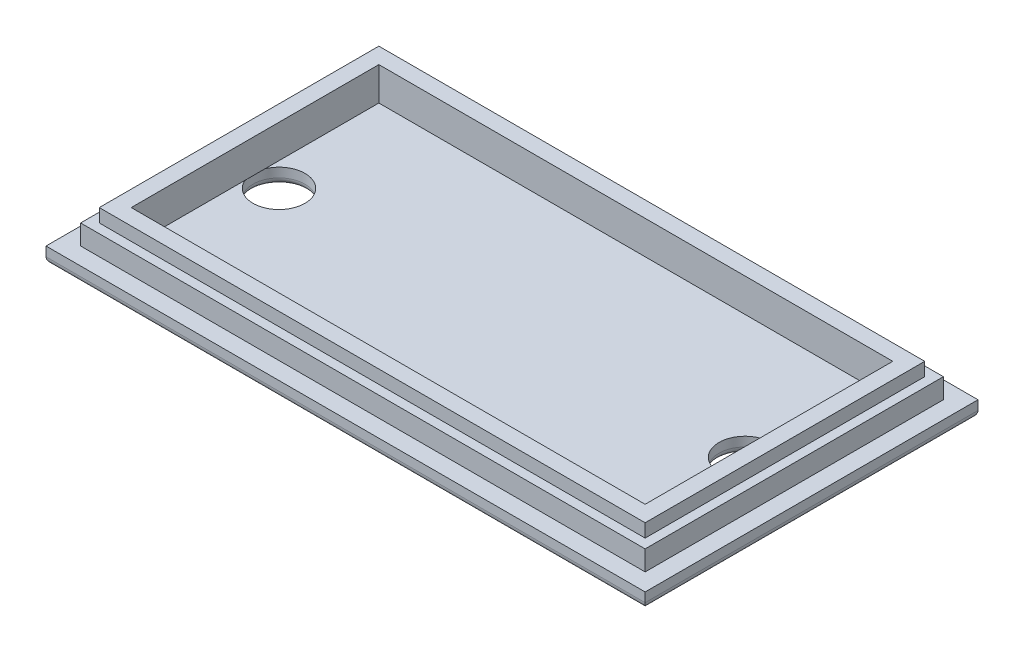
ISO-10303-21;
HEADER;
FILE_DESCRIPTION(('STEP AP214'),'2;1');
FILE_NAME('part.step','',(''),(''),'','','');
FILE_SCHEMA(('AUTOMOTIVE_DESIGN { 1 0 10303 214 1 1 1 1 }'));
ENDSEC;
DATA;
#1=APPLICATION_CONTEXT('core data for automotive mechanical design processes');
#2=APPLICATION_PROTOCOL_DEFINITION('international standard','automotive_design',2000,#1);
#3=PRODUCT_CONTEXT('',#1,'mechanical');
#4=PRODUCT('Part','Part','',(#3));
#5=PRODUCT_RELATED_PRODUCT_CATEGORY('part','',(#4));
#6=PRODUCT_DEFINITION_FORMATION('','',#4);
#7=PRODUCT_DEFINITION_CONTEXT('part definition',#1,'design');
#8=PRODUCT_DEFINITION('design','',#6,#7);
#9=PRODUCT_DEFINITION_SHAPE('','',#8);
#10=(LENGTH_UNIT() NAMED_UNIT(*) SI_UNIT(.MILLI.,.METRE.));
#11=(NAMED_UNIT(*) PLANE_ANGLE_UNIT() SI_UNIT($,.RADIAN.));
#12=(NAMED_UNIT(*) SI_UNIT($,.STERADIAN.) SOLID_ANGLE_UNIT());
#13=UNCERTAINTY_MEASURE_WITH_UNIT(LENGTH_MEASURE(1.E-05),#10,'distance_accuracy_value','');
#14=(GEOMETRIC_REPRESENTATION_CONTEXT(3) GLOBAL_UNCERTAINTY_ASSIGNED_CONTEXT((#13)) GLOBAL_UNIT_ASSIGNED_CONTEXT((#10,
#11,#12)) REPRESENTATION_CONTEXT('',''));
#15=CARTESIAN_POINT('',(0.,0.,0.));
#16=DIRECTION('',(0.,0.,1.));
#17=DIRECTION('',(1.,0.,0.));
#18=AXIS2_PLACEMENT_3D('',#15,#16,#17);
#19=CARTESIAN_POINT('',(0.,1.2,-25.));
#20=DIRECTION('',(0.,1.,0.));
#21=DIRECTION('',(0.,0.,1.));
#22=AXIS2_PLACEMENT_3D('',#19,#20,#21);
#23=PLANE('',#22);
#24=CARTESIAN_POINT('',(40.,1.2,-12.5));
#25=DIRECTION('',(0.,1.,0.));
#26=DIRECTION('',(0.,0.,1.));
#27=AXIS2_PLACEMENT_3D('',#24,#25,#26);
#28=CIRCLE('',#27,1.95);
#29=CARTESIAN_POINT('',(41.8,1.2,-13.25));
#30=VERTEX_POINT('',#29);
#31=CARTESIAN_POINT('',(41.8,1.2,-11.75));
#32=VERTEX_POINT('',#31);
#33=EDGE_CURVE('E297',#30,#32,#28,.T.);
#34=ORIENTED_EDGE('',*,*,#33,.F.);
#35=DIRECTION('',(0.,0.,1.));
#36=VECTOR('',#35,1.);
#37=CARTESIAN_POINT('',(41.8,1.2,-23.));
#38=LINE('',#37,#36);
#39=CARTESIAN_POINT('',(41.8,1.2,-21.8));
#40=VERTEX_POINT('',#39);
#41=EDGE_CURVE('E258',#40,#30,#38,.T.);
#42=ORIENTED_EDGE('',*,*,#41,.F.);
#43=DIRECTION('',(1.,0.,0.));
#44=VECTOR('',#43,1.);
#45=CARTESIAN_POINT('',(2.,1.2,-21.8));
#46=LINE('',#45,#44);
#47=CARTESIAN_POINT('',(3.2,1.2,-21.8));
#48=VERTEX_POINT('',#47);
#49=EDGE_CURVE('E250',#48,#40,#46,.T.);
#50=ORIENTED_EDGE('',*,*,#49,.F.);
#51=DIRECTION('',(0.,0.,1.));
#52=VECTOR('',#51,1.);
#53=CARTESIAN_POINT('',(3.2,1.2,-23.));
#54=LINE('',#53,#52);
#55=CARTESIAN_POINT('',(3.2,1.2,-13.25));
#56=VERTEX_POINT('',#55);
#57=EDGE_CURVE('E253',#48,#56,#54,.T.);
#58=ORIENTED_EDGE('',*,*,#57,.T.);
#59=CARTESIAN_POINT('',(5.,1.2,-12.5));
#60=DIRECTION('',(0.,1.,0.));
#61=DIRECTION('',(0.,0.,1.));
#62=AXIS2_PLACEMENT_3D('',#59,#60,#61);
#63=CIRCLE('',#62,1.95);
#64=CARTESIAN_POINT('',(3.2,1.2,-11.75));
#65=VERTEX_POINT('',#64);
#66=EDGE_CURVE('E286',#65,#56,#63,.T.);
#67=ORIENTED_EDGE('',*,*,#66,.F.);
#68=CARTESIAN_POINT('',(3.2,1.2,-3.2));
#69=VERTEX_POINT('',#68);
#70=EDGE_CURVE('E263',#65,#69,#54,.T.);
#71=ORIENTED_EDGE('',*,*,#70,.T.);
#72=DIRECTION('',(1.,0.,0.));
#73=VECTOR('',#72,1.);
#74=CARTESIAN_POINT('',(2.,1.2,-3.2));
#75=LINE('',#74,#73);
#76=CARTESIAN_POINT('',(41.8,1.2,-3.2));
#77=VERTEX_POINT('',#76);
#78=EDGE_CURVE('E260',#69,#77,#75,.T.);
#79=ORIENTED_EDGE('',*,*,#78,.T.);
#80=EDGE_CURVE('E244',#32,#77,#38,.T.);
#81=ORIENTED_EDGE('',*,*,#80,.F.);
#82=EDGE_LOOP('',(#34,#42,#50,#58,#67,#71,#79,#81));
#83=FACE_BOUND('',#82,.T.);
#84=ADVANCED_FACE('F81',(#83),#23,.T.);
#85=DIRECTION('',(-1.,0.,0.));
#86=VECTOR('',#85,1.);
#87=CARTESIAN_POINT('',(0.,1.2,0.));
#88=LINE('',#87,#86);
#89=CARTESIAN_POINT('',(45.,1.2,0.));
#90=VERTEX_POINT('',#89);
#91=CARTESIAN_POINT('',(0.,1.2,0.));
#92=VERTEX_POINT('',#91);
#93=EDGE_CURVE('E336',#90,#92,#88,.T.);
#94=ORIENTED_EDGE('',*,*,#93,.F.);
#95=DIRECTION('',(0.,0.,1.));
#96=VECTOR('',#95,1.);
#97=CARTESIAN_POINT('',(45.,1.2,-25.));
#98=LINE('',#97,#96);
#99=CARTESIAN_POINT('',(45.,1.2,-25.));
#100=VERTEX_POINT('',#99);
#101=EDGE_CURVE('E341',#100,#90,#98,.T.);
#102=ORIENTED_EDGE('',*,*,#101,.F.);
#103=DIRECTION('',(-1.,0.,0.));
#104=VECTOR('',#103,1.);
#105=CARTESIAN_POINT('',(0.,1.2,-25.));
#106=LINE('',#105,#104);
#107=CARTESIAN_POINT('',(0.,1.2,-25.));
#108=VERTEX_POINT('',#107);
#109=EDGE_CURVE('E338',#100,#108,#106,.T.);
#110=ORIENTED_EDGE('',*,*,#109,.T.);
#111=DIRECTION('',(0.,0.,1.));
#112=VECTOR('',#111,1.);
#113=CARTESIAN_POINT('',(0.,1.2,-25.));
#114=LINE('',#113,#112);
#115=EDGE_CURVE('E347',#108,#92,#114,.T.);
#116=ORIENTED_EDGE('',*,*,#115,.T.);
#117=EDGE_LOOP('',(#94,#102,#110,#116));
#118=FACE_BOUND('',#117,.T.);
#119=DIRECTION('',(1.,0.,0.));
#120=VECTOR('',#119,1.);
#121=CARTESIAN_POINT('',(1.3,1.2,-1.3));
#122=LINE('',#121,#120);
#123=CARTESIAN_POINT('',(1.3,1.2,-1.3));
#124=VERTEX_POINT('',#123);
#125=CARTESIAN_POINT('',(43.7,1.2,-1.3));
#126=VERTEX_POINT('',#125);
#127=EDGE_CURVE('E314',#124,#126,#122,.T.);
#128=ORIENTED_EDGE('',*,*,#127,.F.);
#129=DIRECTION('',(0.,0.,1.));
#130=VECTOR('',#129,1.);
#131=CARTESIAN_POINT('',(1.3,1.2,-23.7));
#132=LINE('',#131,#130);
#133=CARTESIAN_POINT('',(1.3,1.2,-23.7));
#134=VERTEX_POINT('',#133);
#135=EDGE_CURVE('E311',#134,#124,#132,.T.);
#136=ORIENTED_EDGE('',*,*,#135,.F.);
#137=DIRECTION('',(1.,0.,0.));
#138=VECTOR('',#137,1.);
#139=CARTESIAN_POINT('',(1.3,1.2,-23.7));
#140=LINE('',#139,#138);
#141=CARTESIAN_POINT('',(43.7,1.2,-23.7));
#142=VERTEX_POINT('',#141);
#143=EDGE_CURVE('E302',#134,#142,#140,.T.);
#144=ORIENTED_EDGE('',*,*,#143,.T.);
#145=DIRECTION('',(0.,0.,1.));
#146=VECTOR('',#145,1.);
#147=CARTESIAN_POINT('',(43.7,1.2,-23.7));
#148=LINE('',#147,#146);
#149=EDGE_CURVE('E318',#142,#126,#148,.T.);
#150=ORIENTED_EDGE('',*,*,#149,.T.);
#151=EDGE_LOOP('',(#128,#136,#144,#150));
#152=FACE_BOUND('',#151,.T.);
#153=ADVANCED_FACE('F424',(#118,#152),#23,.T.);
#154=CARTESIAN_POINT('',(0.,0.,-25.));
#155=DIRECTION('',(-1.,0.,0.));
#156=DIRECTION('',(0.,0.,1.));
#157=AXIS2_PLACEMENT_3D('',#154,#155,#156);
#158=PLANE('',#157);
#159=DIRECTION('',(0.,-1.,0.));
#160=VECTOR('',#159,1.);
#161=CARTESIAN_POINT('',(0.,0.,-25.));
#162=LINE('',#161,#160);
#163=CARTESIAN_POINT('',(0.,0.5,-25.));
#164=VERTEX_POINT('',#163);
#165=EDGE_CURVE('E333',#108,#164,#162,.T.);
#166=ORIENTED_EDGE('',*,*,#165,.T.);
#167=DIRECTION('',(0.,0.,1.));
#168=VECTOR('',#167,1.);
#169=CARTESIAN_POINT('',(0.,0.5,-25.));
#170=LINE('',#169,#168);
#171=CARTESIAN_POINT('',(0.,0.5,0.));
#172=VERTEX_POINT('',#171);
#173=EDGE_CURVE('E98',#164,#172,#170,.T.);
#174=ORIENTED_EDGE('',*,*,#173,.T.);
#175=DIRECTION('',(0.,-1.,0.));
#176=VECTOR('',#175,1.);
#177=CARTESIAN_POINT('',(0.,0.,0.));
#178=LINE('',#177,#176);
#179=EDGE_CURVE('E332',#92,#172,#178,.T.);
#180=ORIENTED_EDGE('',*,*,#179,.F.);
#181=ORIENTED_EDGE('',*,*,#115,.F.);
#182=EDGE_LOOP('',(#166,#174,#180,#181));
#183=FACE_BOUND('',#182,.T.);
#184=ADVANCED_FACE('F429',(#183),#158,.T.);
#185=CARTESIAN_POINT('',(45.,0.,-25.));
#186=DIRECTION('',(1.,0.,0.));
#187=DIRECTION('',(0.,0.,-1.));
#188=AXIS2_PLACEMENT_3D('',#185,#186,#187);
#189=PLANE('',#188);
#190=DIRECTION('',(0.,1.,0.));
#191=VECTOR('',#190,1.);
#192=CARTESIAN_POINT('',(45.,0.,0.));
#193=LINE('',#192,#191);
#194=CARTESIAN_POINT('',(45.,0.5,0.));
#195=VERTEX_POINT('',#194);
#196=EDGE_CURVE('E343',#195,#90,#193,.T.);
#197=ORIENTED_EDGE('',*,*,#196,.F.);
#198=DIRECTION('',(0.,0.,1.));
#199=VECTOR('',#198,1.);
#200=CARTESIAN_POINT('',(45.,0.5,-25.));
#201=LINE('',#200,#199);
#202=CARTESIAN_POINT('',(45.,0.5,-25.));
#203=VERTEX_POINT('',#202);
#204=EDGE_CURVE('E378',#195,#203,#201,.F.);
#205=ORIENTED_EDGE('',*,*,#204,.T.);
#206=DIRECTION('',(0.,1.,0.));
#207=VECTOR('',#206,1.);
#208=CARTESIAN_POINT('',(45.,0.,-25.));
#209=LINE('',#208,#207);
#210=EDGE_CURVE('E335',#203,#100,#209,.T.);
#211=ORIENTED_EDGE('',*,*,#210,.T.);
#212=ORIENTED_EDGE('',*,*,#101,.T.);
#213=EDGE_LOOP('',(#197,#205,#211,#212));
#214=FACE_BOUND('',#213,.T.);
#215=ADVANCED_FACE('F435',(#214),#189,.T.);
#216=CARTESIAN_POINT('',(0.,0.,-25.));
#217=DIRECTION('',(0.,-1.,0.));
#218=DIRECTION('',(0.,0.,-1.));
#219=AXIS2_PLACEMENT_3D('',#216,#217,#218);
#220=PLANE('',#219);
#221=DIRECTION('',(1.,0.,0.));
#222=VECTOR('',#221,1.);
#223=CARTESIAN_POINT('',(0.,0.,-24.5));
#224=LINE('',#223,#222);
#225=CARTESIAN_POINT('',(0.5,0.,-24.5));
#226=VERTEX_POINT('',#225);
#227=CARTESIAN_POINT('',(44.5,0.,-24.5));
#228=VERTEX_POINT('',#227);
#229=EDGE_CURVE('E373',#226,#228,#224,.T.);
#230=ORIENTED_EDGE('',*,*,#229,.T.);
#231=DIRECTION('',(0.,0.,1.));
#232=VECTOR('',#231,1.);
#233=CARTESIAN_POINT('',(44.5,0.,-25.));
#234=LINE('',#233,#232);
#235=CARTESIAN_POINT('',(44.5,0.,-0.5));
#236=VERTEX_POINT('',#235);
#237=EDGE_CURVE('E375',#228,#236,#234,.T.);
#238=ORIENTED_EDGE('',*,*,#237,.T.);
#239=DIRECTION('',(1.,0.,0.));
#240=VECTOR('',#239,1.);
#241=CARTESIAN_POINT('',(0.,0.,-0.5));
#242=LINE('',#241,#240);
#243=CARTESIAN_POINT('',(0.5,0.,-0.5));
#244=VERTEX_POINT('',#243);
#245=EDGE_CURVE('E369',#236,#244,#242,.F.);
#246=ORIENTED_EDGE('',*,*,#245,.T.);
#247=DIRECTION('',(0.,0.,1.));
#248=VECTOR('',#247,1.);
#249=CARTESIAN_POINT('',(0.5,0.,-25.));
#250=LINE('',#249,#248);
#251=EDGE_CURVE('E371',#244,#226,#250,.F.);
#252=ORIENTED_EDGE('',*,*,#251,.T.);
#253=EDGE_LOOP('',(#230,#238,#246,#252));
#254=FACE_BOUND('',#253,.T.);
#255=CARTESIAN_POINT('',(40.,0.,-12.5));
#256=DIRECTION('',(0.,-1.,0.));
#257=DIRECTION('',(0.,0.,-1.));
#258=AXIS2_PLACEMENT_3D('',#255,#256,#257);
#259=CIRCLE('',#258,2.45);
#260=CARTESIAN_POINT('',(40.,0.,-14.95));
#261=VERTEX_POINT('',#260);
#262=EDGE_CURVE('E366',#261,#261,#259,.F.);
#263=ORIENTED_EDGE('',*,*,#262,.T.);
#264=EDGE_LOOP('',(#263));
#265=FACE_BOUND('',#264,.T.);
#266=CARTESIAN_POINT('',(5.,0.,-12.5));
#267=DIRECTION('',(0.,-1.,0.));
#268=DIRECTION('',(0.,0.,-1.));
#269=AXIS2_PLACEMENT_3D('',#266,#267,#268);
#270=CIRCLE('',#269,2.45);
#271=CARTESIAN_POINT('',(5.,0.,-14.95));
#272=VERTEX_POINT('',#271);
#273=EDGE_CURVE('E363',#272,#272,#270,.F.);
#274=ORIENTED_EDGE('',*,*,#273,.T.);
#275=EDGE_LOOP('',(#274));
#276=FACE_BOUND('',#275,.T.);
#277=ADVANCED_FACE('F438',(#254,#265,#276),#220,.T.);
#278=CARTESIAN_POINT('',(0.,0.,-25.));
#279=DIRECTION('',(0.,0.,-1.));
#280=DIRECTION('',(-1.,0.,0.));
#281=AXIS2_PLACEMENT_3D('',#278,#279,#280);
#282=PLANE('',#281);
#283=ORIENTED_EDGE('',*,*,#210,.F.);
#284=DIRECTION('',(1.,0.,0.));
#285=VECTOR('',#284,1.);
#286=CARTESIAN_POINT('',(0.,0.5,-25.));
#287=LINE('',#286,#285);
#288=EDGE_CURVE('E106',#203,#164,#287,.F.);
#289=ORIENTED_EDGE('',*,*,#288,.T.);
#290=ORIENTED_EDGE('',*,*,#165,.F.);
#291=ORIENTED_EDGE('',*,*,#109,.F.);
#292=EDGE_LOOP('',(#283,#289,#290,#291));
#293=FACE_BOUND('',#292,.T.);
#294=ADVANCED_FACE('F442',(#293),#282,.T.);
#295=CARTESIAN_POINT('',(0.,0.,0.));
#296=DIRECTION('',(0.,0.,-1.));
#297=DIRECTION('',(-1.,0.,0.));
#298=AXIS2_PLACEMENT_3D('',#295,#296,#297);
#299=PLANE('',#298);
#300=ORIENTED_EDGE('',*,*,#179,.T.);
#301=DIRECTION('',(1.,0.,0.));
#302=VECTOR('',#301,1.);
#303=CARTESIAN_POINT('',(45.,0.5,0.));
#304=LINE('',#303,#302);
#305=EDGE_CURVE('E383',#172,#195,#304,.T.);
#306=ORIENTED_EDGE('',*,*,#305,.T.);
#307=ORIENTED_EDGE('',*,*,#196,.T.);
#308=ORIENTED_EDGE('',*,*,#93,.T.);
#309=EDGE_LOOP('',(#300,#306,#307,#308));
#310=FACE_BOUND('',#309,.T.);
#311=ADVANCED_FACE('F433',(#310),#299,.F.);
#312=CARTESIAN_POINT('',(0.,2.7,0.));
#313=DIRECTION('',(0.,1.,0.));
#314=DIRECTION('',(0.,0.,1.));
#315=AXIS2_PLACEMENT_3D('',#312,#313,#314);
#316=PLANE('',#315);
#317=DIRECTION('',(0.,0.,-1.));
#318=VECTOR('',#317,1.);
#319=CARTESIAN_POINT('',(43.,2.7,0.));
#320=LINE('',#319,#318);
#321=CARTESIAN_POINT('',(43.,2.7,-2.));
#322=VERTEX_POINT('',#321);
#323=CARTESIAN_POINT('',(43.,2.7,-23.));
#324=VERTEX_POINT('',#323);
#325=EDGE_CURVE('E361',#322,#324,#320,.T.);
#326=ORIENTED_EDGE('',*,*,#325,.F.);
#327=DIRECTION('',(-1.,0.,0.));
#328=VECTOR('',#327,1.);
#329=CARTESIAN_POINT('',(0.,2.7,-2.));
#330=LINE('',#329,#328);
#331=CARTESIAN_POINT('',(2.,2.7,-2.));
#332=VERTEX_POINT('',#331);
#333=EDGE_CURVE('E349',#322,#332,#330,.T.);
#334=ORIENTED_EDGE('',*,*,#333,.T.);
#335=DIRECTION('',(0.,0.,-1.));
#336=VECTOR('',#335,1.);
#337=CARTESIAN_POINT('',(2.,2.7,0.));
#338=LINE('',#337,#336);
#339=CARTESIAN_POINT('',(2.,2.7,-23.));
#340=VERTEX_POINT('',#339);
#341=EDGE_CURVE('E356',#332,#340,#338,.T.);
#342=ORIENTED_EDGE('',*,*,#341,.T.);
#343=DIRECTION('',(-1.,0.,0.));
#344=VECTOR('',#343,1.);
#345=CARTESIAN_POINT('',(0.,2.7,-23.));
#346=LINE('',#345,#344);
#347=EDGE_CURVE('E359',#324,#340,#346,.T.);
#348=ORIENTED_EDGE('',*,*,#347,.F.);
#349=EDGE_LOOP('',(#326,#334,#342,#348));
#350=FACE_BOUND('',#349,.T.);
#351=DIRECTION('',(0.,0.,1.));
#352=VECTOR('',#351,1.);
#353=CARTESIAN_POINT('',(1.3,2.7,-23.7));
#354=LINE('',#353,#352);
#355=CARTESIAN_POINT('',(1.3,2.7,-23.7));
#356=VERTEX_POINT('',#355);
#357=CARTESIAN_POINT('',(1.3,2.7,-1.3));
#358=VERTEX_POINT('',#357);
#359=EDGE_CURVE('E298',#356,#358,#354,.T.);
#360=ORIENTED_EDGE('',*,*,#359,.T.);
#361=DIRECTION('',(1.,0.,0.));
#362=VECTOR('',#361,1.);
#363=CARTESIAN_POINT('',(1.3,2.7,-1.3));
#364=LINE('',#363,#362);
#365=CARTESIAN_POINT('',(43.7,2.7,-1.3));
#366=VERTEX_POINT('',#365);
#367=EDGE_CURVE('E301',#358,#366,#364,.T.);
#368=ORIENTED_EDGE('',*,*,#367,.T.);
#369=DIRECTION('',(0.,0.,1.));
#370=VECTOR('',#369,1.);
#371=CARTESIAN_POINT('',(43.7,2.7,-23.7));
#372=LINE('',#371,#370);
#373=CARTESIAN_POINT('',(43.7,2.7,-23.7));
#374=VERTEX_POINT('',#373);
#375=EDGE_CURVE('E304',#374,#366,#372,.T.);
#376=ORIENTED_EDGE('',*,*,#375,.F.);
#377=DIRECTION('',(1.,0.,0.));
#378=VECTOR('',#377,1.);
#379=CARTESIAN_POINT('',(1.3,2.7,-23.7));
#380=LINE('',#379,#378);
#381=EDGE_CURVE('E307',#356,#374,#380,.T.);
#382=ORIENTED_EDGE('',*,*,#381,.F.);
#383=EDGE_LOOP('',(#360,#368,#376,#382));
#384=FACE_BOUND('',#383,.T.);
#385=ADVANCED_FACE('F481',(#350,#384),#316,.T.);
#386=CARTESIAN_POINT('',(1.3,2.7,-23.7));
#387=DIRECTION('',(1.,0.,0.));
#388=DIRECTION('',(0.,0.,-1.));
#389=AXIS2_PLACEMENT_3D('',#386,#387,#388);
#390=PLANE('',#389);
#391=ORIENTED_EDGE('',*,*,#135,.T.);
#392=DIRECTION('',(0.,-1.,0.));
#393=VECTOR('',#392,1.);
#394=CARTESIAN_POINT('',(1.3,2.7,-1.3));
#395=LINE('',#394,#393);
#396=EDGE_CURVE('E329',#358,#124,#395,.T.);
#397=ORIENTED_EDGE('',*,*,#396,.F.);
#398=ORIENTED_EDGE('',*,*,#359,.F.);
#399=DIRECTION('',(0.,-1.,0.));
#400=VECTOR('',#399,1.);
#401=CARTESIAN_POINT('',(1.3,2.7,-23.7));
#402=LINE('',#401,#400);
#403=EDGE_CURVE('E310',#356,#134,#402,.T.);
#404=ORIENTED_EDGE('',*,*,#403,.T.);
#405=EDGE_LOOP('',(#391,#397,#398,#404));
#406=FACE_BOUND('',#405,.T.);
#407=ADVANCED_FACE('F483',(#406),#390,.F.);
#408=CARTESIAN_POINT('',(1.3,2.7,-1.3));
#409=DIRECTION('',(0.,0.,-1.));
#410=DIRECTION('',(-1.,0.,0.));
#411=AXIS2_PLACEMENT_3D('',#408,#409,#410);
#412=PLANE('',#411);
#413=ORIENTED_EDGE('',*,*,#127,.T.);
#414=DIRECTION('',(0.,-1.,0.));
#415=VECTOR('',#414,1.);
#416=CARTESIAN_POINT('',(43.7,2.7,-1.3));
#417=LINE('',#416,#415);
#418=EDGE_CURVE('E326',#366,#126,#417,.T.);
#419=ORIENTED_EDGE('',*,*,#418,.F.);
#420=ORIENTED_EDGE('',*,*,#367,.F.);
#421=ORIENTED_EDGE('',*,*,#396,.T.);
#422=EDGE_LOOP('',(#413,#419,#420,#421));
#423=FACE_BOUND('',#422,.T.);
#424=ADVANCED_FACE('F488',(#423),#412,.F.);
#425=CARTESIAN_POINT('',(43.7,2.7,-23.7));
#426=DIRECTION('',(1.,0.,0.));
#427=DIRECTION('',(0.,0.,-1.));
#428=AXIS2_PLACEMENT_3D('',#425,#426,#427);
#429=PLANE('',#428);
#430=ORIENTED_EDGE('',*,*,#149,.F.);
#431=DIRECTION('',(0.,-1.,0.));
#432=VECTOR('',#431,1.);
#433=CARTESIAN_POINT('',(43.7,2.7,-23.7));
#434=LINE('',#433,#432);
#435=EDGE_CURVE('E323',#374,#142,#434,.T.);
#436=ORIENTED_EDGE('',*,*,#435,.F.);
#437=ORIENTED_EDGE('',*,*,#375,.T.);
#438=ORIENTED_EDGE('',*,*,#418,.T.);
#439=EDGE_LOOP('',(#430,#436,#437,#438));
#440=FACE_BOUND('',#439,.T.);
#441=ADVANCED_FACE('F476',(#440),#429,.T.);
#442=CARTESIAN_POINT('',(1.3,2.7,-23.7));
#443=DIRECTION('',(0.,0.,-1.));
#444=DIRECTION('',(-1.,0.,0.));
#445=AXIS2_PLACEMENT_3D('',#442,#443,#444);
#446=PLANE('',#445);
#447=ORIENTED_EDGE('',*,*,#143,.F.);
#448=ORIENTED_EDGE('',*,*,#403,.F.);
#449=ORIENTED_EDGE('',*,*,#381,.T.);
#450=ORIENTED_EDGE('',*,*,#435,.T.);
#451=EDGE_LOOP('',(#447,#448,#449,#450));
#452=FACE_BOUND('',#451,.T.);
#453=ADVANCED_FACE('F471',(#452),#446,.T.);
#454=CARTESIAN_POINT('',(40.,0.,-12.5));
#455=DIRECTION('',(0.,-1.,0.));
#456=DIRECTION('',(0.,0.,-1.));
#457=AXIS2_PLACEMENT_3D('',#454,#455,#456);
#458=CYLINDRICAL_SURFACE('',#457,1.95);
#459=CARTESIAN_POINT('',(40.,0.5,-12.5));
#460=DIRECTION('',(0.,-1.,0.));
#461=DIRECTION('',(0.,0.,-1.));
#462=AXIS2_PLACEMENT_3D('',#459,#460,#461);
#463=CIRCLE('',#462,1.95);
#464=CARTESIAN_POINT('',(40.,0.5,-14.45));
#465=VERTEX_POINT('',#464);
#466=EDGE_CURVE('E90',#465,#465,#463,.T.);
#467=ORIENTED_EDGE('',*,*,#466,.T.);
#468=EDGE_LOOP('',(#467));
#469=FACE_BOUND('',#468,.T.);
#470=EDGE_CURVE('E315',#32,#30,#28,.T.);
#471=ORIENTED_EDGE('',*,*,#470,.T.);
#472=ORIENTED_EDGE('',*,*,#33,.T.);
#473=EDGE_LOOP('',(#471,#472));
#474=FACE_BOUND('',#473,.T.);
#475=ADVANCED_FACE('F407',(#469,#474),#458,.F.);
#476=CARTESIAN_POINT('',(5.,0.,-12.5));
#477=DIRECTION('',(0.,-1.,0.));
#478=DIRECTION('',(0.,0.,-1.));
#479=AXIS2_PLACEMENT_3D('',#476,#477,#478);
#480=CYLINDRICAL_SURFACE('',#479,1.95);
#481=CARTESIAN_POINT('',(5.,0.5,-12.5));
#482=DIRECTION('',(0.,-1.,0.));
#483=DIRECTION('',(0.,0.,-1.));
#484=AXIS2_PLACEMENT_3D('',#481,#482,#483);
#485=CIRCLE('',#484,1.95);
#486=CARTESIAN_POINT('',(5.,0.5,-14.45));
#487=VERTEX_POINT('',#486);
#488=EDGE_CURVE('E12',#487,#487,#485,.T.);
#489=ORIENTED_EDGE('',*,*,#488,.T.);
#490=EDGE_LOOP('',(#489));
#491=FACE_BOUND('',#490,.T.);
#492=EDGE_CURVE('E294',#56,#65,#63,.T.);
#493=ORIENTED_EDGE('',*,*,#492,.T.);
#494=ORIENTED_EDGE('',*,*,#66,.T.);
#495=EDGE_LOOP('',(#493,#494));
#496=FACE_BOUND('',#495,.T.);
#497=ADVANCED_FACE('F411',(#491,#496),#480,.F.);
#498=CARTESIAN_POINT('',(0.,1.2,0.));
#499=DIRECTION('',(0.,1.,0.));
#500=DIRECTION('',(0.,0.,1.));
#501=AXIS2_PLACEMENT_3D('',#498,#499,#500);
#502=PLANE('',#501);
#503=EDGE_CURVE('E261',#30,#32,#38,.T.);
#504=ORIENTED_EDGE('',*,*,#503,.F.);
#505=ORIENTED_EDGE('',*,*,#470,.F.);
#506=EDGE_LOOP('',(#504,#505));
#507=FACE_BOUND('',#506,.T.);
#508=ADVANCED_FACE('F408',(#507),#502,.F.);
#509=EDGE_CURVE('E265',#56,#65,#54,.T.);
#510=ORIENTED_EDGE('',*,*,#509,.T.);
#511=ORIENTED_EDGE('',*,*,#492,.F.);
#512=EDGE_LOOP('',(#510,#511));
#513=FACE_BOUND('',#512,.T.);
#514=ADVANCED_FACE('F410',(#513),#502,.F.);
#515=CARTESIAN_POINT('',(43.,3.7,-23.));
#516=DIRECTION('',(1.,0.,0.));
#517=DIRECTION('',(0.,0.,-1.));
#518=AXIS2_PLACEMENT_3D('',#515,#516,#517);
#519=PLANE('',#518);
#520=DIRECTION('',(0.,-1.,0.));
#521=VECTOR('',#520,1.);
#522=CARTESIAN_POINT('',(43.,3.7,-2.));
#523=LINE('',#522,#521);
#524=CARTESIAN_POINT('',(43.,3.7,-2.));
#525=VERTEX_POINT('',#524);
#526=EDGE_CURVE('E282',#525,#322,#523,.T.);
#527=ORIENTED_EDGE('',*,*,#526,.T.);
#528=ORIENTED_EDGE('',*,*,#325,.T.);
#529=DIRECTION('',(0.,-1.,0.));
#530=VECTOR('',#529,1.);
#531=CARTESIAN_POINT('',(43.,3.7,-23.));
#532=LINE('',#531,#530);
#533=CARTESIAN_POINT('',(43.,3.7,-23.));
#534=VERTEX_POINT('',#533);
#535=EDGE_CURVE('E283',#534,#324,#532,.T.);
#536=ORIENTED_EDGE('',*,*,#535,.F.);
#537=DIRECTION('',(0.,0.,1.));
#538=VECTOR('',#537,1.);
#539=CARTESIAN_POINT('',(43.,3.7,-23.));
#540=LINE('',#539,#538);
#541=EDGE_CURVE('E269',#534,#525,#540,.T.);
#542=ORIENTED_EDGE('',*,*,#541,.T.);
#543=EDGE_LOOP('',(#527,#528,#536,#542));
#544=FACE_BOUND('',#543,.T.);
#545=ADVANCED_FACE('F417',(#544),#519,.T.);
#546=CARTESIAN_POINT('',(2.,3.7,-23.));
#547=DIRECTION('',(0.,0.,-1.));
#548=DIRECTION('',(-1.,0.,0.));
#549=AXIS2_PLACEMENT_3D('',#546,#547,#548);
#550=PLANE('',#549);
#551=ORIENTED_EDGE('',*,*,#535,.T.);
#552=ORIENTED_EDGE('',*,*,#347,.T.);
#553=DIRECTION('',(0.,-1.,0.));
#554=VECTOR('',#553,1.);
#555=CARTESIAN_POINT('',(2.,3.7,-23.));
#556=LINE('',#555,#554);
#557=CARTESIAN_POINT('',(2.,3.7,-23.));
#558=VERTEX_POINT('',#557);
#559=EDGE_CURVE('E287',#558,#340,#556,.T.);
#560=ORIENTED_EDGE('',*,*,#559,.F.);
#561=DIRECTION('',(1.,0.,0.));
#562=VECTOR('',#561,1.);
#563=CARTESIAN_POINT('',(2.,3.7,-23.));
#564=LINE('',#563,#562);
#565=EDGE_CURVE('E279',#558,#534,#564,.T.);
#566=ORIENTED_EDGE('',*,*,#565,.T.);
#567=EDGE_LOOP('',(#551,#552,#560,#566));
#568=FACE_BOUND('',#567,.T.);
#569=ADVANCED_FACE('F547',(#568),#550,.T.);
#570=CARTESIAN_POINT('',(2.,3.7,-23.));
#571=DIRECTION('',(1.,0.,0.));
#572=DIRECTION('',(0.,0.,-1.));
#573=AXIS2_PLACEMENT_3D('',#570,#571,#572);
#574=PLANE('',#573);
#575=ORIENTED_EDGE('',*,*,#341,.F.);
#576=DIRECTION('',(0.,-1.,0.));
#577=VECTOR('',#576,1.);
#578=CARTESIAN_POINT('',(2.,3.7,-2.));
#579=LINE('',#578,#577);
#580=CARTESIAN_POINT('',(2.,3.7,-2.));
#581=VERTEX_POINT('',#580);
#582=EDGE_CURVE('E290',#581,#332,#579,.T.);
#583=ORIENTED_EDGE('',*,*,#582,.F.);
#584=DIRECTION('',(0.,0.,1.));
#585=VECTOR('',#584,1.);
#586=CARTESIAN_POINT('',(2.,3.7,-23.));
#587=LINE('',#586,#585);
#588=EDGE_CURVE('E277',#558,#581,#587,.T.);
#589=ORIENTED_EDGE('',*,*,#588,.F.);
#590=ORIENTED_EDGE('',*,*,#559,.T.);
#591=EDGE_LOOP('',(#575,#583,#589,#590));
#592=FACE_BOUND('',#591,.T.);
#593=ADVANCED_FACE('F541',(#592),#574,.F.);
#594=CARTESIAN_POINT('',(2.,3.7,-2.));
#595=DIRECTION('',(0.,0.,-1.));
#596=DIRECTION('',(-1.,0.,0.));
#597=AXIS2_PLACEMENT_3D('',#594,#595,#596);
#598=PLANE('',#597);
#599=ORIENTED_EDGE('',*,*,#333,.F.);
#600=ORIENTED_EDGE('',*,*,#526,.F.);
#601=DIRECTION('',(1.,0.,0.));
#602=VECTOR('',#601,1.);
#603=CARTESIAN_POINT('',(2.,3.7,-2.));
#604=LINE('',#603,#602);
#605=EDGE_CURVE('E275',#581,#525,#604,.T.);
#606=ORIENTED_EDGE('',*,*,#605,.F.);
#607=ORIENTED_EDGE('',*,*,#582,.T.);
#608=EDGE_LOOP('',(#599,#600,#606,#607));
#609=FACE_BOUND('',#608,.T.);
#610=ADVANCED_FACE('F537',(#609),#598,.F.);
#611=CARTESIAN_POINT('',(0.,3.7,0.));
#612=DIRECTION('',(0.,1.,0.));
#613=DIRECTION('',(0.,0.,1.));
#614=AXIS2_PLACEMENT_3D('',#611,#612,#613);
#615=PLANE('',#614);
#616=DIRECTION('',(0.,0.,1.));
#617=VECTOR('',#616,1.);
#618=CARTESIAN_POINT('',(41.8,3.7,-23.));
#619=LINE('',#618,#617);
#620=CARTESIAN_POINT('',(41.8,3.7,-21.8));
#621=VERTEX_POINT('',#620);
#622=CARTESIAN_POINT('',(41.8,3.7,-3.2));
#623=VERTEX_POINT('',#622);
#624=EDGE_CURVE('E235',#621,#623,#619,.T.);
#625=ORIENTED_EDGE('',*,*,#624,.T.);
#626=DIRECTION('',(1.,0.,0.));
#627=VECTOR('',#626,1.);
#628=CARTESIAN_POINT('',(2.,3.7,-3.2));
#629=LINE('',#628,#627);
#630=CARTESIAN_POINT('',(3.2,3.7,-3.2));
#631=VERTEX_POINT('',#630);
#632=EDGE_CURVE('E223',#631,#623,#629,.T.);
#633=ORIENTED_EDGE('',*,*,#632,.F.);
#634=DIRECTION('',(0.,0.,1.));
#635=VECTOR('',#634,1.);
#636=CARTESIAN_POINT('',(3.2,3.7,-23.));
#637=LINE('',#636,#635);
#638=CARTESIAN_POINT('',(3.2,3.7,-21.8));
#639=VERTEX_POINT('',#638);
#640=EDGE_CURVE('E234',#639,#631,#637,.T.);
#641=ORIENTED_EDGE('',*,*,#640,.F.);
#642=DIRECTION('',(1.,0.,0.));
#643=VECTOR('',#642,1.);
#644=CARTESIAN_POINT('',(2.,3.7,-21.8));
#645=LINE('',#644,#643);
#646=EDGE_CURVE('E245',#639,#621,#645,.T.);
#647=ORIENTED_EDGE('',*,*,#646,.T.);
#648=EDGE_LOOP('',(#625,#633,#641,#647));
#649=FACE_BOUND('',#648,.T.);
#650=ORIENTED_EDGE('',*,*,#541,.F.);
#651=ORIENTED_EDGE('',*,*,#565,.F.);
#652=ORIENTED_EDGE('',*,*,#588,.T.);
#653=ORIENTED_EDGE('',*,*,#605,.T.);
#654=EDGE_LOOP('',(#650,#651,#652,#653));
#655=FACE_BOUND('',#654,.T.);
#656=ADVANCED_FACE('F247',(#649,#655),#615,.T.);
#657=CARTESIAN_POINT('',(41.8,3.7,-23.));
#658=DIRECTION('',(1.,0.,0.));
#659=DIRECTION('',(0.,0.,-1.));
#660=AXIS2_PLACEMENT_3D('',#657,#658,#659);
#661=PLANE('',#660);
#662=ORIENTED_EDGE('',*,*,#41,.T.);
#663=ORIENTED_EDGE('',*,*,#503,.T.);
#664=ORIENTED_EDGE('',*,*,#80,.T.);
#665=DIRECTION('',(0.,-1.,0.));
#666=VECTOR('',#665,1.);
#667=CARTESIAN_POINT('',(41.8,3.7,-3.2));
#668=LINE('',#667,#666);
#669=EDGE_CURVE('E227',#623,#77,#668,.T.);
#670=ORIENTED_EDGE('',*,*,#669,.F.);
#671=ORIENTED_EDGE('',*,*,#624,.F.);
#672=DIRECTION('',(0.,-1.,0.));
#673=VECTOR('',#672,1.);
#674=CARTESIAN_POINT('',(41.8,3.7,-21.8));
#675=LINE('',#674,#673);
#676=EDGE_CURVE('E267',#621,#40,#675,.T.);
#677=ORIENTED_EDGE('',*,*,#676,.T.);
#678=EDGE_LOOP('',(#662,#663,#664,#670,#671,#677));
#679=FACE_BOUND('',#678,.T.);
#680=ADVANCED_FACE('F240',(#679),#661,.F.);
#681=CARTESIAN_POINT('',(2.,3.7,-21.8));
#682=DIRECTION('',(0.,0.,-1.));
#683=DIRECTION('',(-1.,0.,0.));
#684=AXIS2_PLACEMENT_3D('',#681,#682,#683);
#685=PLANE('',#684);
#686=ORIENTED_EDGE('',*,*,#49,.T.);
#687=ORIENTED_EDGE('',*,*,#676,.F.);
#688=ORIENTED_EDGE('',*,*,#646,.F.);
#689=DIRECTION('',(0.,-1.,0.));
#690=VECTOR('',#689,1.);
#691=CARTESIAN_POINT('',(3.2,3.7,-21.8));
#692=LINE('',#691,#690);
#693=EDGE_CURVE('E270',#639,#48,#692,.T.);
#694=ORIENTED_EDGE('',*,*,#693,.T.);
#695=EDGE_LOOP('',(#686,#687,#688,#694));
#696=FACE_BOUND('',#695,.T.);
#697=ADVANCED_FACE('F525',(#696),#685,.F.);
#698=CARTESIAN_POINT('',(3.2,3.7,-23.));
#699=DIRECTION('',(1.,0.,0.));
#700=DIRECTION('',(0.,0.,-1.));
#701=AXIS2_PLACEMENT_3D('',#698,#699,#700);
#702=PLANE('',#701);
#703=ORIENTED_EDGE('',*,*,#57,.F.);
#704=ORIENTED_EDGE('',*,*,#693,.F.);
#705=ORIENTED_EDGE('',*,*,#640,.T.);
#706=DIRECTION('',(0.,-1.,0.));
#707=VECTOR('',#706,1.);
#708=CARTESIAN_POINT('',(3.2,3.7,-3.2));
#709=LINE('',#708,#707);
#710=EDGE_CURVE('E229',#631,#69,#709,.T.);
#711=ORIENTED_EDGE('',*,*,#710,.T.);
#712=ORIENTED_EDGE('',*,*,#70,.F.);
#713=ORIENTED_EDGE('',*,*,#509,.F.);
#714=EDGE_LOOP('',(#703,#704,#705,#711,#712,#713));
#715=FACE_BOUND('',#714,.T.);
#716=ADVANCED_FACE('F522',(#715),#702,.T.);
#717=CARTESIAN_POINT('',(2.,3.7,-3.2));
#718=DIRECTION('',(0.,0.,-1.));
#719=DIRECTION('',(-1.,0.,0.));
#720=AXIS2_PLACEMENT_3D('',#717,#718,#719);
#721=PLANE('',#720);
#722=ORIENTED_EDGE('',*,*,#78,.F.);
#723=ORIENTED_EDGE('',*,*,#710,.F.);
#724=ORIENTED_EDGE('',*,*,#632,.T.);
#725=ORIENTED_EDGE('',*,*,#669,.T.);
#726=EDGE_LOOP('',(#722,#723,#724,#725));
#727=FACE_BOUND('',#726,.T.);
#728=ADVANCED_FACE('F226',(#727),#721,.T.);
#729=CARTESIAN_POINT('',(0.5,0.5,-25.));
#730=DIRECTION('',(0.,0.,1.));
#731=DIRECTION('',(1.,0.,0.));
#732=AXIS2_PLACEMENT_3D('',#729,#730,#731);
#733=CYLINDRICAL_SURFACE('',#732,0.5);
#734=CARTESIAN_POINT('',(0.5,0.5,-0.5));
#735=DIRECTION('',(-0.707106781186547,0.,-0.707106781186547));
#736=DIRECTION('',(-0.707106781186547,0.,0.707106781186547));
#737=AXIS2_PLACEMENT_3D('',#734,#735,#736);
#738=ELLIPSE('',#737,0.707106781186547,0.5);
#739=EDGE_CURVE('E390',#172,#244,#738,.F.);
#740=ORIENTED_EDGE('',*,*,#739,.F.);
#741=ORIENTED_EDGE('',*,*,#173,.F.);
#742=CARTESIAN_POINT('',(0.5,0.5,-24.5));
#743=DIRECTION('',(-0.707106781186547,0.,0.707106781186547));
#744=DIRECTION('',(0.707106781186547,0.,0.707106781186547));
#745=AXIS2_PLACEMENT_3D('',#742,#743,#744);
#746=ELLIPSE('',#745,0.707106781186547,0.5);
#747=EDGE_CURVE('E85',#226,#164,#746,.F.);
#748=ORIENTED_EDGE('',*,*,#747,.F.);
#749=ORIENTED_EDGE('',*,*,#251,.F.);
#750=EDGE_LOOP('',(#740,#741,#748,#749));
#751=FACE_BOUND('',#750,.T.);
#752=ADVANCED_FACE('F457',(#751),#733,.T.);
#753=CARTESIAN_POINT('',(0.,0.5,-24.5));
#754=DIRECTION('',(1.,0.,0.));
#755=DIRECTION('',(0.,0.,-1.));
#756=AXIS2_PLACEMENT_3D('',#753,#754,#755);
#757=CYLINDRICAL_SURFACE('',#756,0.5);
#758=ORIENTED_EDGE('',*,*,#747,.T.);
#759=ORIENTED_EDGE('',*,*,#288,.F.);
#760=CARTESIAN_POINT('',(44.5,0.5,-24.5));
#761=DIRECTION('',(0.707106781186547,0.,0.707106781186547));
#762=DIRECTION('',(0.707106781186547,0.,-0.707106781186547));
#763=AXIS2_PLACEMENT_3D('',#760,#761,#762);
#764=ELLIPSE('',#763,0.707106781186547,0.5);
#765=EDGE_CURVE('E389',#228,#203,#764,.T.);
#766=ORIENTED_EDGE('',*,*,#765,.F.);
#767=ORIENTED_EDGE('',*,*,#229,.F.);
#768=EDGE_LOOP('',(#758,#759,#766,#767));
#769=FACE_BOUND('',#768,.T.);
#770=ADVANCED_FACE('F454',(#769),#757,.T.);
#771=CARTESIAN_POINT('',(0.,0.5,-0.5));
#772=DIRECTION('',(-1.,0.,0.));
#773=DIRECTION('',(0.,0.,1.));
#774=AXIS2_PLACEMENT_3D('',#771,#772,#773);
#775=CYLINDRICAL_SURFACE('',#774,0.5);
#776=ORIENTED_EDGE('',*,*,#739,.T.);
#777=ORIENTED_EDGE('',*,*,#245,.F.);
#778=CARTESIAN_POINT('',(44.5,0.5,-0.5));
#779=DIRECTION('',(-0.707106781186547,0.,0.707106781186547));
#780=DIRECTION('',(-0.707106781186547,0.,-0.707106781186547));
#781=AXIS2_PLACEMENT_3D('',#778,#779,#780);
#782=ELLIPSE('',#781,0.707106781186547,0.5);
#783=EDGE_CURVE('E387',#195,#236,#782,.F.);
#784=ORIENTED_EDGE('',*,*,#783,.F.);
#785=ORIENTED_EDGE('',*,*,#305,.F.);
#786=EDGE_LOOP('',(#776,#777,#784,#785));
#787=FACE_BOUND('',#786,.T.);
#788=ADVANCED_FACE('F450',(#787),#775,.T.);
#789=CARTESIAN_POINT('',(44.5,0.5,-25.));
#790=DIRECTION('',(0.,0.,1.));
#791=DIRECTION('',(1.,0.,0.));
#792=AXIS2_PLACEMENT_3D('',#789,#790,#791);
#793=CYLINDRICAL_SURFACE('',#792,0.5);
#794=ORIENTED_EDGE('',*,*,#765,.T.);
#795=ORIENTED_EDGE('',*,*,#204,.F.);
#796=ORIENTED_EDGE('',*,*,#783,.T.);
#797=ORIENTED_EDGE('',*,*,#237,.F.);
#798=EDGE_LOOP('',(#794,#795,#796,#797));
#799=FACE_BOUND('',#798,.T.);
#800=ADVANCED_FACE('F446',(#799),#793,.T.);
#801=CARTESIAN_POINT('',(40.,0.5,-12.5));
#802=DIRECTION('',(0.,-1.,0.));
#803=DIRECTION('',(0.,0.,-1.));
#804=AXIS2_PLACEMENT_3D('',#801,#802,#803);
#805=TOROIDAL_SURFACE('',#804,2.45,0.5);
#806=ORIENTED_EDGE('',*,*,#262,.F.);
#807=EDGE_LOOP('',(#806));
#808=FACE_BOUND('',#807,.T.);
#809=ORIENTED_EDGE('',*,*,#466,.F.);
#810=EDGE_LOOP('',(#809));
#811=FACE_BOUND('',#810,.T.);
#812=ADVANCED_FACE('F449',(#808,#811),#805,.T.);
#813=CARTESIAN_POINT('',(5.,0.5,-12.5));
#814=DIRECTION('',(0.,-1.,0.));
#815=DIRECTION('',(0.,0.,-1.));
#816=AXIS2_PLACEMENT_3D('',#813,#814,#815);
#817=TOROIDAL_SURFACE('',#816,2.45,0.5);
#818=ORIENTED_EDGE('',*,*,#273,.F.);
#819=EDGE_LOOP('',(#818));
#820=FACE_BOUND('',#819,.T.);
#821=ORIENTED_EDGE('',*,*,#488,.F.);
#822=EDGE_LOOP('',(#821));
#823=FACE_BOUND('',#822,.T.);
#824=ADVANCED_FACE('F83',(#820,#823),#817,.T.);
#825=CLOSED_SHELL('',(#84,#153,#184,#215,#277,#294,#311,#385,#407,#424,#441,#453,#475,#497,#508,
#514,#545,#569,#593,#610,#656,#680,#697,#716,#728,#752,#770,#788,#800,#812,#824));
#826=MANIFOLD_SOLID_BREP('B2',#825);
#827=ADVANCED_BREP_SHAPE_REPRESENTATION('',(#18,#826),#14);
#828=SHAPE_DEFINITION_REPRESENTATION(#9,#827);
ENDSEC;
END-ISO-10303-21;
